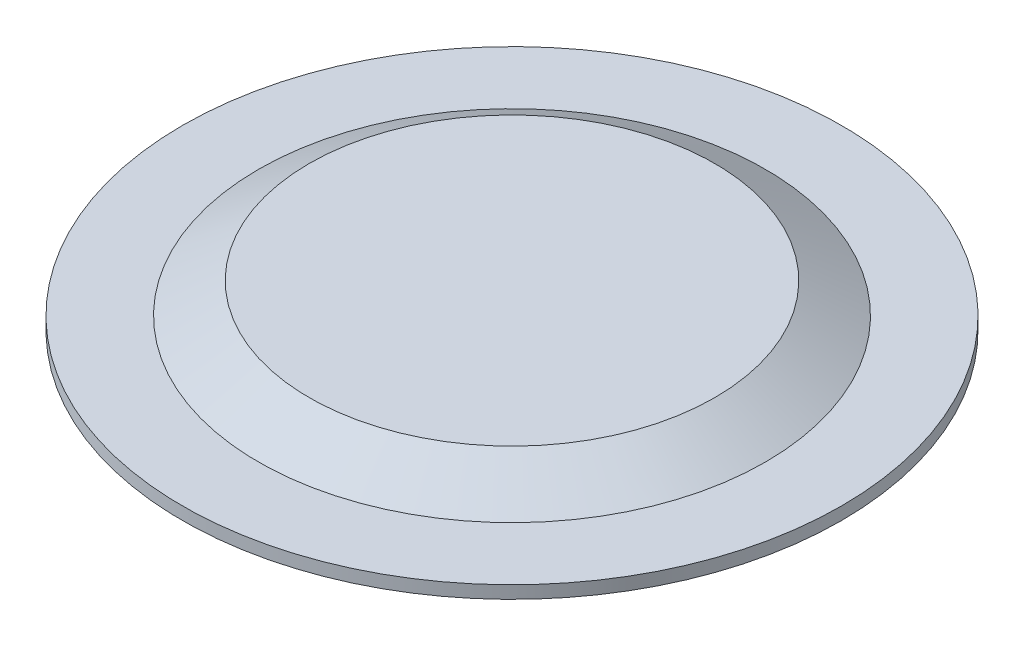
ISO-10303-21;
HEADER;
FILE_DESCRIPTION(('STEP AP214'),'2;1');
FILE_NAME('part.step','',(''),(''),'','','');
FILE_SCHEMA(('AUTOMOTIVE_DESIGN { 1 0 10303 214 1 1 1 1 }'));
ENDSEC;
DATA;
#1=APPLICATION_CONTEXT('core data for automotive mechanical design processes');
#2=APPLICATION_PROTOCOL_DEFINITION('international standard','automotive_design',2000,#1);
#3=PRODUCT_CONTEXT('',#1,'mechanical');
#4=PRODUCT('Part','Part','',(#3));
#5=PRODUCT_RELATED_PRODUCT_CATEGORY('part','',(#4));
#6=PRODUCT_DEFINITION_FORMATION('','',#4);
#7=PRODUCT_DEFINITION_CONTEXT('part definition',#1,'design');
#8=PRODUCT_DEFINITION('design','',#6,#7);
#9=PRODUCT_DEFINITION_SHAPE('','',#8);
#10=(LENGTH_UNIT() NAMED_UNIT(*) SI_UNIT(.MILLI.,.METRE.));
#11=(NAMED_UNIT(*) PLANE_ANGLE_UNIT() SI_UNIT($,.RADIAN.));
#12=(NAMED_UNIT(*) SI_UNIT($,.STERADIAN.) SOLID_ANGLE_UNIT());
#13=UNCERTAINTY_MEASURE_WITH_UNIT(LENGTH_MEASURE(1.E-05),#10,'distance_accuracy_value','');
#14=(GEOMETRIC_REPRESENTATION_CONTEXT(3) GLOBAL_UNCERTAINTY_ASSIGNED_CONTEXT((#13)) GLOBAL_UNIT_ASSIGNED_CONTEXT((#10,
#11,#12)) REPRESENTATION_CONTEXT('',''));
#15=CARTESIAN_POINT('',(0.,0.,0.));
#16=DIRECTION('',(0.,0.,1.));
#17=DIRECTION('',(1.,0.,0.));
#18=AXIS2_PLACEMENT_3D('',#15,#16,#17);
#19=CARTESIAN_POINT('',(0.,2.159,0.));
#20=DIRECTION('',(0.,-1.,0.));
#21=DIRECTION('',(1.,0.,0.));
#22=AXIS2_PLACEMENT_3D('',#19,#20,#21);
#23=PLANE('',#22);
#24=CARTESIAN_POINT('',(0.,2.159,0.));
#25=DIRECTION('',(0.,-1.,0.));
#26=DIRECTION('',(1.,0.,0.));
#27=AXIS2_PLACEMENT_3D('',#24,#25,#26);
#28=CIRCLE('',#27,10.16);
#29=CARTESIAN_POINT('',(10.16,2.159,0.));
#30=VERTEX_POINT('',#29);
#31=EDGE_CURVE('E10',#30,#30,#28,.T.);
#32=ORIENTED_EDGE('',*,*,#31,.F.);
#33=EDGE_LOOP('',(#32));
#34=FACE_BOUND('',#33,.T.);
#35=ADVANCED_FACE('F35',(#34),#23,.F.);
#36=CARTESIAN_POINT('',(0.,2.159,0.));
#37=DIRECTION('',(0.,-1.,0.));
#38=DIRECTION('',(1.,0.,0.));
#39=AXIS2_PLACEMENT_3D('',#36,#37,#38);
#40=CONICAL_SURFACE('',#39,10.16,1.03037682652431);
#41=CARTESIAN_POINT('',(0.,0.635000000000001,0.));
#42=DIRECTION('',(0.,-1.,0.));
#43=DIRECTION('',(1.,0.,0.));
#44=AXIS2_PLACEMENT_3D('',#41,#42,#43);
#45=CIRCLE('',#44,12.7);
#46=CARTESIAN_POINT('',(12.7,0.635000000000001,0.));
#47=VERTEX_POINT('',#46);
#48=EDGE_CURVE('E41',#47,#47,#45,.T.);
#49=ORIENTED_EDGE('',*,*,#48,.F.);
#50=EDGE_LOOP('',(#49));
#51=FACE_BOUND('',#50,.T.);
#52=ORIENTED_EDGE('',*,*,#31,.T.);
#53=EDGE_LOOP('',(#52));
#54=FACE_BOUND('',#53,.T.);
#55=ADVANCED_FACE('F83',(#51,#54),#40,.T.);
#56=CARTESIAN_POINT('',(-12.7,0.635,0.));
#57=DIRECTION('',(0.,-1.,0.));
#58=DIRECTION('',(1.,0.,0.));
#59=AXIS2_PLACEMENT_3D('',#56,#57,#58);
#60=PLANE('',#59);
#61=CARTESIAN_POINT('',(0.,0.635,0.));
#62=DIRECTION('',(0.,-1.,0.));
#63=DIRECTION('',(1.,0.,0.));
#64=AXIS2_PLACEMENT_3D('',#61,#62,#63);
#65=CIRCLE('',#64,16.51);
#66=CARTESIAN_POINT('',(16.51,0.635,0.));
#67=VERTEX_POINT('',#66);
#68=EDGE_CURVE('E45',#67,#67,#65,.T.);
#69=ORIENTED_EDGE('',*,*,#68,.F.);
#70=EDGE_LOOP('',(#69));
#71=FACE_BOUND('',#70,.T.);
#72=ORIENTED_EDGE('',*,*,#48,.T.);
#73=EDGE_LOOP('',(#72));
#74=FACE_BOUND('',#73,.T.);
#75=ADVANCED_FACE('F78',(#71,#74),#60,.F.);
#76=CARTESIAN_POINT('',(0.,0.,0.));
#77=DIRECTION('',(0.,-1.,0.));
#78=DIRECTION('',(1.,0.,0.));
#79=AXIS2_PLACEMENT_3D('',#76,#77,#78);
#80=CYLINDRICAL_SURFACE('',#79,16.51);
#81=CARTESIAN_POINT('',(0.,0.,0.));
#82=DIRECTION('',(0.,-1.,0.));
#83=DIRECTION('',(1.,0.,0.));
#84=AXIS2_PLACEMENT_3D('',#81,#82,#83);
#85=CIRCLE('',#84,16.51);
#86=CARTESIAN_POINT('',(16.51,0.,0.));
#87=VERTEX_POINT('',#86);
#88=EDGE_CURVE('E49',#87,#87,#85,.T.);
#89=ORIENTED_EDGE('',*,*,#88,.F.);
#90=EDGE_LOOP('',(#89));
#91=FACE_BOUND('',#90,.T.);
#92=ORIENTED_EDGE('',*,*,#68,.T.);
#93=EDGE_LOOP('',(#92));
#94=FACE_BOUND('',#93,.T.);
#95=ADVANCED_FACE('F72',(#91,#94),#80,.T.);
#96=CARTESIAN_POINT('',(-16.51,0.,0.));
#97=DIRECTION('',(0.,1.,0.));
#98=DIRECTION('',(-1.,0.,0.));
#99=AXIS2_PLACEMENT_3D('',#96,#97,#98);
#100=PLANE('',#99);
#101=CARTESIAN_POINT('',(0.,0.,0.));
#102=DIRECTION('',(0.,-1.,0.));
#103=DIRECTION('',(1.,0.,0.));
#104=AXIS2_PLACEMENT_3D('',#101,#102,#103);
#105=CIRCLE('',#104,12.5241151822577);
#106=CARTESIAN_POINT('',(12.5241151822577,0.,0.));
#107=VERTEX_POINT('',#106);
#108=EDGE_CURVE('E54',#107,#107,#105,.T.);
#109=ORIENTED_EDGE('',*,*,#108,.F.);
#110=EDGE_LOOP('',(#109));
#111=FACE_BOUND('',#110,.T.);
#112=ORIENTED_EDGE('',*,*,#88,.T.);
#113=EDGE_LOOP('',(#112));
#114=FACE_BOUND('',#113,.T.);
#115=ADVANCED_FACE('F66',(#111,#114),#100,.F.);
#116=CARTESIAN_POINT('',(0.,0.,0.));
#117=DIRECTION('',(0.,-1.,0.));
#118=DIRECTION('',(1.,0.,0.));
#119=AXIS2_PLACEMENT_3D('',#116,#117,#118);
#120=CONICAL_SURFACE('',#119,12.5241151822577,1.03037682652431);
#121=CARTESIAN_POINT('',(0.,1.524,0.));
#122=DIRECTION('',(0.,-1.,0.));
#123=DIRECTION('',(1.,0.,0.));
#124=AXIS2_PLACEMENT_3D('',#121,#122,#123);
#125=CIRCLE('',#124,9.98411518225774);
#126=CARTESIAN_POINT('',(9.98411518225774,1.524,0.));
#127=VERTEX_POINT('',#126);
#128=EDGE_CURVE('E57',#127,#127,#125,.T.);
#129=ORIENTED_EDGE('',*,*,#128,.F.);
#130=EDGE_LOOP('',(#129));
#131=FACE_BOUND('',#130,.T.);
#132=ORIENTED_EDGE('',*,*,#108,.T.);
#133=EDGE_LOOP('',(#132));
#134=FACE_BOUND('',#133,.T.);
#135=ADVANCED_FACE('F63',(#131,#134),#120,.F.);
#136=CARTESIAN_POINT('',(-9.98411518225774,1.524,0.));
#137=DIRECTION('',(0.,1.,0.));
#138=DIRECTION('',(-1.,0.,0.));
#139=AXIS2_PLACEMENT_3D('',#136,#137,#138);
#140=PLANE('',#139);
#141=ORIENTED_EDGE('',*,*,#128,.T.);
#142=EDGE_LOOP('',(#141));
#143=FACE_BOUND('',#142,.T.);
#144=ADVANCED_FACE('F61',(#143),#140,.F.);
#145=CLOSED_SHELL('',(#35,#55,#75,#95,#115,#135,#144));
#146=MANIFOLD_SOLID_BREP('B2',#145);
#147=ADVANCED_BREP_SHAPE_REPRESENTATION('',(#18,#146),#14);
#148=SHAPE_DEFINITION_REPRESENTATION(#9,#147);
ENDSEC;
END-ISO-10303-21;
